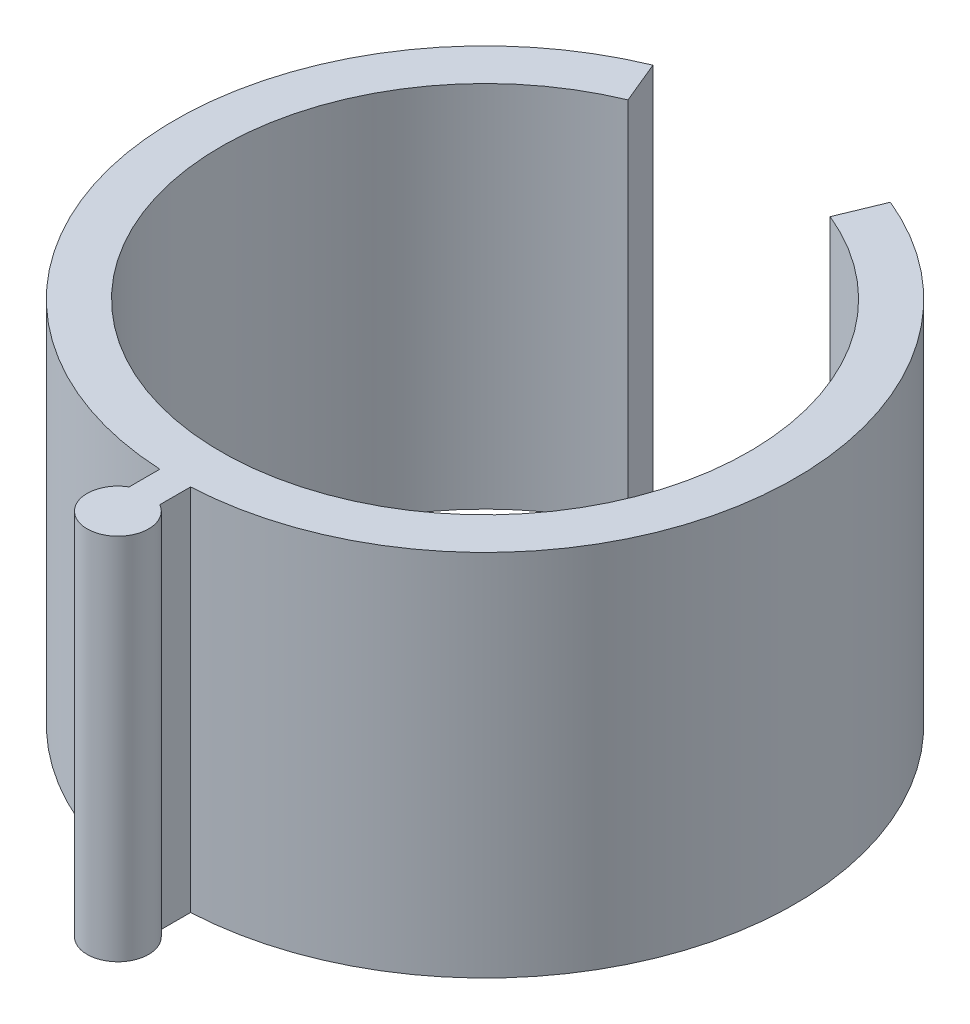
ISO-10303-21;
HEADER;
FILE_DESCRIPTION(('STEP AP214'),'2;1');
FILE_NAME('part.step','',(''),(''),'','','');
FILE_SCHEMA(('AUTOMOTIVE_DESIGN { 1 0 10303 214 1 1 1 1 }'));
ENDSEC;
DATA;
#1=APPLICATION_CONTEXT('core data for automotive mechanical design processes');
#2=APPLICATION_PROTOCOL_DEFINITION('international standard','automotive_design',2000,#1);
#3=PRODUCT_CONTEXT('',#1,'mechanical');
#4=PRODUCT('Part','Part','',(#3));
#5=PRODUCT_RELATED_PRODUCT_CATEGORY('part','',(#4));
#6=PRODUCT_DEFINITION_FORMATION('','',#4);
#7=PRODUCT_DEFINITION_CONTEXT('part definition',#1,'design');
#8=PRODUCT_DEFINITION('design','',#6,#7);
#9=PRODUCT_DEFINITION_SHAPE('','',#8);
#10=(LENGTH_UNIT() NAMED_UNIT(*) SI_UNIT(.MILLI.,.METRE.));
#11=(NAMED_UNIT(*) PLANE_ANGLE_UNIT() SI_UNIT($,.RADIAN.));
#12=(NAMED_UNIT(*) SI_UNIT($,.STERADIAN.) SOLID_ANGLE_UNIT());
#13=UNCERTAINTY_MEASURE_WITH_UNIT(LENGTH_MEASURE(1.E-05),#10,'distance_accuracy_value','');
#14=(GEOMETRIC_REPRESENTATION_CONTEXT(3) GLOBAL_UNCERTAINTY_ASSIGNED_CONTEXT((#13)) GLOBAL_UNIT_ASSIGNED_CONTEXT((#10,
#11,#12)) REPRESENTATION_CONTEXT('',''));
#15=CARTESIAN_POINT('',(0.,0.,0.));
#16=DIRECTION('',(0.,0.,1.));
#17=DIRECTION('',(1.,0.,0.));
#18=AXIS2_PLACEMENT_3D('',#15,#16,#17);
#19=CARTESIAN_POINT('',(0.,15.24,0.));
#20=DIRECTION('',(0.,-1.,0.));
#21=DIRECTION('',(0.,0.,-1.));
#22=AXIS2_PLACEMENT_3D('',#19,#20,#21);
#23=CYLINDRICAL_SURFACE('',#22,12.827);
#24=CARTESIAN_POINT('',(0.,0.,0.));
#25=DIRECTION('',(0.,1.,0.));
#26=DIRECTION('',(0.,0.,1.));
#27=AXIS2_PLACEMENT_3D('',#24,#25,#26);
#28=CIRCLE('',#27,12.827);
#29=CARTESIAN_POINT('',(0.635000000000002,0.,12.8112725363252));
#30=VERTEX_POINT('',#29);
#31=CARTESIAN_POINT('',(4.90868038694701,0.,-11.8506027635223));
#32=VERTEX_POINT('',#31);
#33=EDGE_CURVE('E129',#30,#32,#28,.T.);
#34=ORIENTED_EDGE('',*,*,#33,.T.);
#35=DIRECTION('',(0.,-1.,0.));
#36=VECTOR('',#35,1.);
#37=CARTESIAN_POINT('',(4.90868038694701,15.24,-11.8506027635223));
#38=LINE('',#37,#36);
#39=CARTESIAN_POINT('',(4.90868038694701,15.24,-11.8506027635223));
#40=VERTEX_POINT('',#39);
#41=EDGE_CURVE('E11',#40,#32,#38,.T.);
#42=ORIENTED_EDGE('',*,*,#41,.F.);
#43=CARTESIAN_POINT('',(0.,15.24,0.));
#44=DIRECTION('',(0.,1.,0.));
#45=DIRECTION('',(0.,0.,1.));
#46=AXIS2_PLACEMENT_3D('',#43,#44,#45);
#47=CIRCLE('',#46,12.827);
#48=CARTESIAN_POINT('',(0.635000000000002,15.24,12.8112725363252));
#49=VERTEX_POINT('',#48);
#50=EDGE_CURVE('E143',#49,#40,#47,.T.);
#51=ORIENTED_EDGE('',*,*,#50,.F.);
#52=DIRECTION('',(0.,-1.,0.));
#53=VECTOR('',#52,1.);
#54=CARTESIAN_POINT('',(0.635000000000002,15.24,12.8112725363252));
#55=LINE('',#54,#53);
#56=EDGE_CURVE('E125',#49,#30,#55,.T.);
#57=ORIENTED_EDGE('',*,*,#56,.T.);
#58=EDGE_LOOP('',(#34,#42,#51,#57));
#59=FACE_BOUND('',#58,.T.);
#60=ADVANCED_FACE('F33',(#59),#23,.T.);
#61=CARTESIAN_POINT('',(4.90868038694701,15.24,-11.8506027635223));
#62=DIRECTION('',(0.923879532511287,0.,0.38268343236509));
#63=DIRECTION('',(0.38268343236509,0.,-0.923879532511287));
#64=AXIS2_PLACEMENT_3D('',#61,#62,#63);
#65=PLANE('',#64);
#66=DIRECTION('',(-0.38268343236509,0.,0.923879532511287));
#67=VECTOR('',#66,1.);
#68=CARTESIAN_POINT('',(4.90868038694701,0.,-11.8506027635223));
#69=LINE('',#68,#67);
#70=CARTESIAN_POINT('',(4.17966844829152,0.,-10.0906122540883));
#71=VERTEX_POINT('',#70);
#72=EDGE_CURVE('E132',#32,#71,#69,.T.);
#73=ORIENTED_EDGE('',*,*,#72,.T.);
#74=DIRECTION('',(0.,-1.,0.));
#75=VECTOR('',#74,1.);
#76=CARTESIAN_POINT('',(4.17966844829152,15.24,-10.0906122540883));
#77=LINE('',#76,#75);
#78=CARTESIAN_POINT('',(4.17966844829152,15.24,-10.0906122540883));
#79=VERTEX_POINT('',#78);
#80=EDGE_CURVE('E41',#79,#71,#77,.T.);
#81=ORIENTED_EDGE('',*,*,#80,.F.);
#82=DIRECTION('',(-0.38268343236509,0.,0.923879532511287));
#83=VECTOR('',#82,1.);
#84=CARTESIAN_POINT('',(4.90868038694701,15.24,-11.8506027635223));
#85=LINE('',#84,#83);
#86=EDGE_CURVE('E92',#40,#79,#85,.T.);
#87=ORIENTED_EDGE('',*,*,#86,.F.);
#88=ORIENTED_EDGE('',*,*,#41,.T.);
#89=EDGE_LOOP('',(#73,#81,#87,#88));
#90=FACE_BOUND('',#89,.T.);
#91=ADVANCED_FACE('F178',(#90),#65,.F.);
#92=CARTESIAN_POINT('',(0.,15.24,0.));
#93=DIRECTION('',(0.,-1.,0.));
#94=DIRECTION('',(0.,0.,-1.));
#95=AXIS2_PLACEMENT_3D('',#92,#93,#94);
#96=CYLINDRICAL_SURFACE('',#95,10.922);
#97=CARTESIAN_POINT('',(0.,0.,0.));
#98=DIRECTION('',(0.,-1.,0.));
#99=DIRECTION('',(0.,0.,1.));
#100=AXIS2_PLACEMENT_3D('',#97,#98,#99);
#101=CIRCLE('',#100,10.922);
#102=CARTESIAN_POINT('',(-4.17966844829152,0.,-10.0906122540883));
#103=VERTEX_POINT('',#102);
#104=EDGE_CURVE('E134',#71,#103,#101,.T.);
#105=ORIENTED_EDGE('',*,*,#104,.T.);
#106=DIRECTION('',(0.,-1.,0.));
#107=VECTOR('',#106,1.);
#108=CARTESIAN_POINT('',(-4.17966844829152,15.24,-10.0906122540883));
#109=LINE('',#108,#107);
#110=CARTESIAN_POINT('',(-4.17966844829152,15.24,-10.0906122540883));
#111=VERTEX_POINT('',#110);
#112=EDGE_CURVE('E150',#111,#103,#109,.T.);
#113=ORIENTED_EDGE('',*,*,#112,.F.);
#114=CARTESIAN_POINT('',(0.,15.24,0.));
#115=DIRECTION('',(0.,-1.,0.));
#116=DIRECTION('',(0.,0.,1.));
#117=AXIS2_PLACEMENT_3D('',#114,#115,#116);
#118=CIRCLE('',#117,10.922);
#119=EDGE_CURVE('E158',#79,#111,#118,.T.);
#120=ORIENTED_EDGE('',*,*,#119,.F.);
#121=ORIENTED_EDGE('',*,*,#80,.T.);
#122=EDGE_LOOP('',(#105,#113,#120,#121));
#123=FACE_BOUND('',#122,.T.);
#124=ADVANCED_FACE('F156',(#123),#96,.F.);
#125=CARTESIAN_POINT('',(-4.90868038694702,15.24,-11.8506027635223));
#126=DIRECTION('',(-0.923879532511286,0.,0.382683432365091));
#127=DIRECTION('',(0.382683432365091,0.,0.923879532511286));
#128=AXIS2_PLACEMENT_3D('',#125,#126,#127);
#129=PLANE('',#128);
#130=DIRECTION('',(-0.382683432365091,0.,-0.923879532511286));
#131=VECTOR('',#130,1.);
#132=CARTESIAN_POINT('',(-4.90868038694702,0.,-11.8506027635223));
#133=LINE('',#132,#131);
#134=CARTESIAN_POINT('',(-4.90868038694701,0.,-11.8506027635223));
#135=VERTEX_POINT('',#134);
#136=EDGE_CURVE('E136',#103,#135,#133,.T.);
#137=ORIENTED_EDGE('',*,*,#136,.T.);
#138=DIRECTION('',(0.,-1.,0.));
#139=VECTOR('',#138,1.);
#140=CARTESIAN_POINT('',(-4.90868038694701,15.24,-11.8506027635223));
#141=LINE('',#140,#139);
#142=CARTESIAN_POINT('',(-4.90868038694701,15.24,-11.8506027635223));
#143=VERTEX_POINT('',#142);
#144=EDGE_CURVE('E147',#143,#135,#141,.T.);
#145=ORIENTED_EDGE('',*,*,#144,.F.);
#146=DIRECTION('',(-0.382683432365091,0.,-0.923879532511286));
#147=VECTOR('',#146,1.);
#148=CARTESIAN_POINT('',(-4.90868038694702,15.24,-11.8506027635223));
#149=LINE('',#148,#147);
#150=EDGE_CURVE('E170',#111,#143,#149,.T.);
#151=ORIENTED_EDGE('',*,*,#150,.F.);
#152=ORIENTED_EDGE('',*,*,#112,.T.);
#153=EDGE_LOOP('',(#137,#145,#151,#152));
#154=FACE_BOUND('',#153,.T.);
#155=ADVANCED_FACE('F166',(#154),#129,.F.);
#156=CARTESIAN_POINT('',(0.,15.24,0.));
#157=DIRECTION('',(0.,-1.,0.));
#158=DIRECTION('',(0.,0.,-1.));
#159=AXIS2_PLACEMENT_3D('',#156,#157,#158);
#160=CYLINDRICAL_SURFACE('',#159,12.827);
#161=CARTESIAN_POINT('',(0.,0.,0.));
#162=DIRECTION('',(0.,1.,0.));
#163=DIRECTION('',(0.,0.,1.));
#164=AXIS2_PLACEMENT_3D('',#161,#162,#163);
#165=CIRCLE('',#164,12.827);
#166=CARTESIAN_POINT('',(-0.634999999999998,0.,12.8112725363252));
#167=VERTEX_POINT('',#166);
#168=EDGE_CURVE('E138',#135,#167,#165,.T.);
#169=ORIENTED_EDGE('',*,*,#168,.T.);
#170=DIRECTION('',(0.,-1.,0.));
#171=VECTOR('',#170,1.);
#172=CARTESIAN_POINT('',(-0.634999999999998,15.24,12.8112725363252));
#173=LINE('',#172,#171);
#174=CARTESIAN_POINT('',(-0.634999999999998,15.24,12.8112725363252));
#175=VERTEX_POINT('',#174);
#176=EDGE_CURVE('E120',#175,#167,#173,.T.);
#177=ORIENTED_EDGE('',*,*,#176,.F.);
#178=CARTESIAN_POINT('',(0.,15.24,0.));
#179=DIRECTION('',(0.,1.,0.));
#180=DIRECTION('',(0.,0.,1.));
#181=AXIS2_PLACEMENT_3D('',#178,#179,#180);
#182=CIRCLE('',#181,12.827);
#183=EDGE_CURVE('E111',#143,#175,#182,.T.);
#184=ORIENTED_EDGE('',*,*,#183,.F.);
#185=ORIENTED_EDGE('',*,*,#144,.T.);
#186=EDGE_LOOP('',(#169,#177,#184,#185));
#187=FACE_BOUND('',#186,.T.);
#188=ADVANCED_FACE('F169',(#187),#160,.T.);
#189=CARTESIAN_POINT('',(-0.634999999999998,15.24,12.8112725363252));
#190=DIRECTION('',(1.,0.,0.));
#191=DIRECTION('',(0.,0.,-1.));
#192=AXIS2_PLACEMENT_3D('',#189,#190,#191);
#193=PLANE('',#192);
#194=DIRECTION('',(0.,0.,1.));
#195=VECTOR('',#194,1.);
#196=CARTESIAN_POINT('',(-0.634999999999998,0.,12.8112725363252));
#197=LINE('',#196,#195);
#198=CARTESIAN_POINT('',(-0.634999999999998,0.,14.0812725363252));
#199=VERTEX_POINT('',#198);
#200=EDGE_CURVE('E119',#167,#199,#197,.T.);
#201=ORIENTED_EDGE('',*,*,#200,.T.);
#202=DIRECTION('',(0.,-1.,0.));
#203=VECTOR('',#202,1.);
#204=CARTESIAN_POINT('',(-0.634999999999998,15.24,14.0812725363252));
#205=LINE('',#204,#203);
#206=CARTESIAN_POINT('',(-0.634999999999998,15.24,14.0812725363252));
#207=VERTEX_POINT('',#206);
#208=EDGE_CURVE('E116',#207,#199,#205,.T.);
#209=ORIENTED_EDGE('',*,*,#208,.F.);
#210=DIRECTION('',(0.,0.,1.));
#211=VECTOR('',#210,1.);
#212=CARTESIAN_POINT('',(-0.634999999999998,15.24,12.8112725363252));
#213=LINE('',#212,#211);
#214=EDGE_CURVE('E105',#175,#207,#213,.T.);
#215=ORIENTED_EDGE('',*,*,#214,.F.);
#216=ORIENTED_EDGE('',*,*,#176,.T.);
#217=EDGE_LOOP('',(#201,#209,#215,#216));
#218=FACE_BOUND('',#217,.T.);
#219=ADVANCED_FACE('F117',(#218),#193,.F.);
#220=CARTESIAN_POINT('',(0.,15.24,15.1811247991314));
#221=DIRECTION('',(0.,-1.,0.));
#222=DIRECTION('',(0.,0.,-1.));
#223=AXIS2_PLACEMENT_3D('',#220,#221,#222);
#224=CYLINDRICAL_SURFACE('',#223,1.27);
#225=CARTESIAN_POINT('',(0.,0.,15.1811247991314));
#226=DIRECTION('',(0.,1.,0.));
#227=DIRECTION('',(0.,0.,1.));
#228=AXIS2_PLACEMENT_3D('',#225,#226,#227);
#229=CIRCLE('',#228,1.27);
#230=CARTESIAN_POINT('',(0.635000000000002,0.,14.0812725363252));
#231=VERTEX_POINT('',#230);
#232=EDGE_CURVE('E78',#199,#231,#229,.T.);
#233=ORIENTED_EDGE('',*,*,#232,.T.);
#234=DIRECTION('',(0.,-1.,0.));
#235=VECTOR('',#234,1.);
#236=CARTESIAN_POINT('',(0.635000000000002,15.24,14.0812725363252));
#237=LINE('',#236,#235);
#238=CARTESIAN_POINT('',(0.635000000000002,15.24,14.0812725363252));
#239=VERTEX_POINT('',#238);
#240=EDGE_CURVE('E121',#239,#231,#237,.T.);
#241=ORIENTED_EDGE('',*,*,#240,.F.);
#242=CARTESIAN_POINT('',(0.,15.24,15.1811247991314));
#243=DIRECTION('',(0.,1.,0.));
#244=DIRECTION('',(0.,0.,1.));
#245=AXIS2_PLACEMENT_3D('',#242,#243,#244);
#246=CIRCLE('',#245,1.27);
#247=EDGE_CURVE('E109',#207,#239,#246,.T.);
#248=ORIENTED_EDGE('',*,*,#247,.F.);
#249=ORIENTED_EDGE('',*,*,#208,.T.);
#250=EDGE_LOOP('',(#233,#241,#248,#249));
#251=FACE_BOUND('',#250,.T.);
#252=ADVANCED_FACE('F123',(#251),#224,.T.);
#253=CARTESIAN_POINT('',(0.635000000000002,15.24,12.8112725363252));
#254=DIRECTION('',(-1.,0.,0.));
#255=DIRECTION('',(0.,0.,1.));
#256=AXIS2_PLACEMENT_3D('',#253,#254,#255);
#257=PLANE('',#256);
#258=DIRECTION('',(0.,0.,-1.));
#259=VECTOR('',#258,1.);
#260=CARTESIAN_POINT('',(0.635000000000002,0.,12.8112725363252));
#261=LINE('',#260,#259);
#262=EDGE_CURVE('E84',#231,#30,#261,.T.);
#263=ORIENTED_EDGE('',*,*,#262,.T.);
#264=ORIENTED_EDGE('',*,*,#56,.F.);
#265=DIRECTION('',(0.,0.,-1.));
#266=VECTOR('',#265,1.);
#267=CARTESIAN_POINT('',(0.635000000000002,15.24,12.8112725363252));
#268=LINE('',#267,#266);
#269=EDGE_CURVE('E49',#239,#49,#268,.T.);
#270=ORIENTED_EDGE('',*,*,#269,.F.);
#271=ORIENTED_EDGE('',*,*,#240,.T.);
#272=EDGE_LOOP('',(#263,#264,#270,#271));
#273=FACE_BOUND('',#272,.T.);
#274=ADVANCED_FACE('F194',(#273),#257,.F.);
#275=CARTESIAN_POINT('',(0.,15.24,0.));
#276=DIRECTION('',(0.,1.,0.));
#277=DIRECTION('',(0.,0.,1.));
#278=AXIS2_PLACEMENT_3D('',#275,#276,#277);
#279=PLANE('',#278);
#280=ORIENTED_EDGE('',*,*,#50,.T.);
#281=ORIENTED_EDGE('',*,*,#86,.T.);
#282=ORIENTED_EDGE('',*,*,#119,.T.);
#283=ORIENTED_EDGE('',*,*,#150,.T.);
#284=ORIENTED_EDGE('',*,*,#183,.T.);
#285=ORIENTED_EDGE('',*,*,#214,.T.);
#286=ORIENTED_EDGE('',*,*,#247,.T.);
#287=ORIENTED_EDGE('',*,*,#269,.T.);
#288=EDGE_LOOP('',(#280,#281,#282,#283,#284,#285,#286,#287));
#289=FACE_BOUND('',#288,.T.);
#290=ADVANCED_FACE('F107',(#289),#279,.T.);
#291=CARTESIAN_POINT('',(0.,0.,0.));
#292=DIRECTION('',(0.,1.,0.));
#293=DIRECTION('',(0.,0.,1.));
#294=AXIS2_PLACEMENT_3D('',#291,#292,#293);
#295=PLANE('',#294);
#296=ORIENTED_EDGE('',*,*,#33,.F.);
#297=ORIENTED_EDGE('',*,*,#262,.F.);
#298=ORIENTED_EDGE('',*,*,#232,.F.);
#299=ORIENTED_EDGE('',*,*,#200,.F.);
#300=ORIENTED_EDGE('',*,*,#168,.F.);
#301=ORIENTED_EDGE('',*,*,#136,.F.);
#302=ORIENTED_EDGE('',*,*,#104,.F.);
#303=ORIENTED_EDGE('',*,*,#72,.F.);
#304=EDGE_LOOP('',(#296,#297,#298,#299,#300,#301,#302,#303));
#305=FACE_BOUND('',#304,.T.);
#306=ADVANCED_FACE('F162',(#305),#295,.F.);
#307=CLOSED_SHELL('',(#60,#91,#124,#155,#188,#219,#252,#274,#290,#306));
#308=MANIFOLD_SOLID_BREP('B2',#307);
#309=ADVANCED_BREP_SHAPE_REPRESENTATION('',(#18,#308),#14);
#310=SHAPE_DEFINITION_REPRESENTATION(#9,#309);
ENDSEC;
END-ISO-10303-21;
